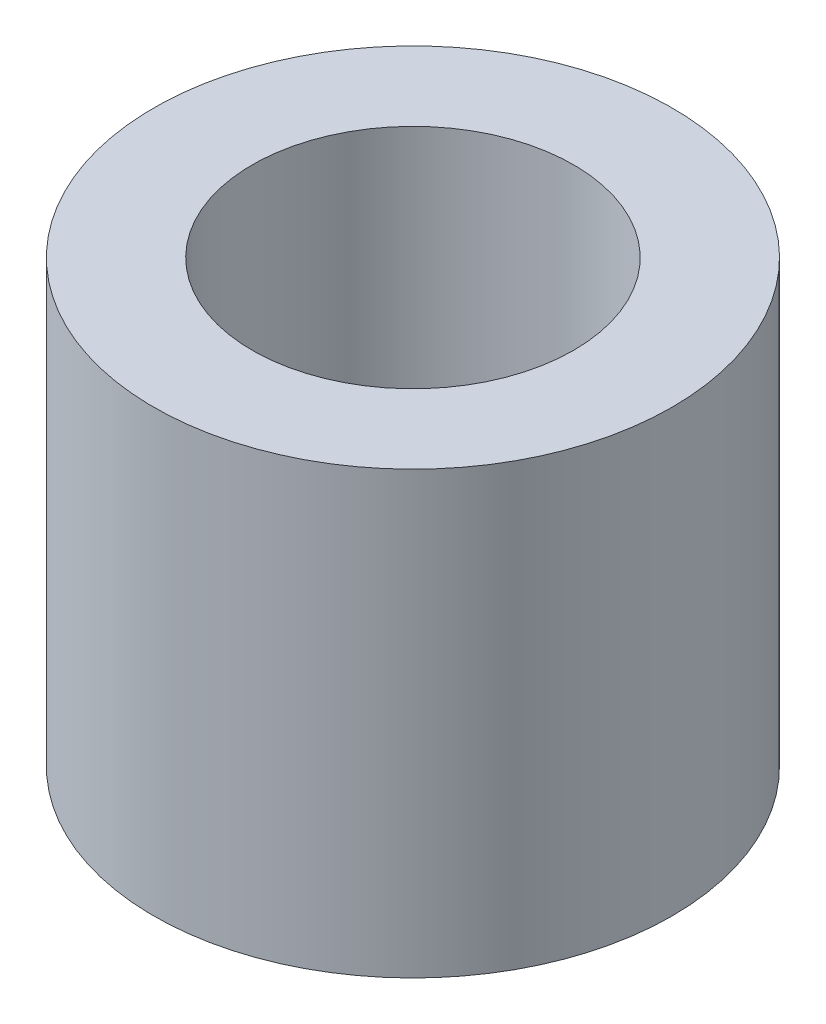
ISO-10303-21;
HEADER;
FILE_DESCRIPTION(('STEP AP214'),'2;1');
FILE_NAME('part.step','',(''),(''),'','','');
FILE_SCHEMA(('AUTOMOTIVE_DESIGN { 1 0 10303 214 1 1 1 1 }'));
ENDSEC;
DATA;
#1=APPLICATION_CONTEXT('core data for automotive mechanical design processes');
#2=APPLICATION_PROTOCOL_DEFINITION('international standard','automotive_design',2000,#1);
#3=PRODUCT_CONTEXT('',#1,'mechanical');
#4=PRODUCT('Part','Part','',(#3));
#5=PRODUCT_RELATED_PRODUCT_CATEGORY('part','',(#4));
#6=PRODUCT_DEFINITION_FORMATION('','',#4);
#7=PRODUCT_DEFINITION_CONTEXT('part definition',#1,'design');
#8=PRODUCT_DEFINITION('design','',#6,#7);
#9=PRODUCT_DEFINITION_SHAPE('','',#8);
#10=(LENGTH_UNIT() NAMED_UNIT(*) SI_UNIT(.MILLI.,.METRE.));
#11=(NAMED_UNIT(*) PLANE_ANGLE_UNIT() SI_UNIT($,.RADIAN.));
#12=(NAMED_UNIT(*) SI_UNIT($,.STERADIAN.) SOLID_ANGLE_UNIT());
#13=UNCERTAINTY_MEASURE_WITH_UNIT(LENGTH_MEASURE(1.E-05),#10,'distance_accuracy_value','');
#14=(GEOMETRIC_REPRESENTATION_CONTEXT(3) GLOBAL_UNCERTAINTY_ASSIGNED_CONTEXT((#13)) GLOBAL_UNIT_ASSIGNED_CONTEXT((#10,
#11,#12)) REPRESENTATION_CONTEXT('',''));
#15=CARTESIAN_POINT('',(0.,0.,0.));
#16=DIRECTION('',(0.,0.,1.));
#17=DIRECTION('',(1.,0.,0.));
#18=AXIS2_PLACEMENT_3D('',#15,#16,#17);
#19=CARTESIAN_POINT('',(0.,8.5,0.));
#20=DIRECTION('',(0.,1.,0.));
#21=DIRECTION('',(1.,0.,0.));
#22=AXIS2_PLACEMENT_3D('',#19,#20,#21);
#23=PLANE('',#22);
#24=CARTESIAN_POINT('',(0.,8.5,0.));
#25=DIRECTION('',(0.,1.,0.));
#26=DIRECTION('',(1.,0.,0.));
#27=AXIS2_PLACEMENT_3D('',#24,#25,#26);
#28=CIRCLE('',#27,10.);
#29=CARTESIAN_POINT('',(10.,8.5,0.));
#30=VERTEX_POINT('',#29);
#31=EDGE_CURVE('E10',#30,#30,#28,.T.);
#32=ORIENTED_EDGE('',*,*,#31,.T.);
#33=EDGE_LOOP('',(#32));
#34=FACE_BOUND('',#33,.T.);
#35=CARTESIAN_POINT('',(0.,8.5,0.));
#36=DIRECTION('',(0.,1.,0.));
#37=DIRECTION('',(1.,0.,0.));
#38=AXIS2_PLACEMENT_3D('',#35,#36,#37);
#39=CIRCLE('',#38,6.2);
#40=CARTESIAN_POINT('',(6.2,8.5,0.));
#41=VERTEX_POINT('',#40);
#42=EDGE_CURVE('E31',#41,#41,#39,.T.);
#43=ORIENTED_EDGE('',*,*,#42,.F.);
#44=EDGE_LOOP('',(#43));
#45=FACE_BOUND('',#44,.T.);
#46=ADVANCED_FACE('F15',(#34,#45),#23,.T.);
#47=CARTESIAN_POINT('',(0.,-8.5,0.));
#48=DIRECTION('',(0.,1.,0.));
#49=DIRECTION('',(1.,0.,0.));
#50=AXIS2_PLACEMENT_3D('',#47,#48,#49);
#51=PLANE('',#50);
#52=CARTESIAN_POINT('',(0.,-8.5,0.));
#53=DIRECTION('',(0.,1.,0.));
#54=DIRECTION('',(1.,0.,0.));
#55=AXIS2_PLACEMENT_3D('',#52,#53,#54);
#56=CIRCLE('',#55,10.);
#57=CARTESIAN_POINT('',(10.,-8.5,0.));
#58=VERTEX_POINT('',#57);
#59=EDGE_CURVE('E22',#58,#58,#56,.T.);
#60=ORIENTED_EDGE('',*,*,#59,.F.);
#61=EDGE_LOOP('',(#60));
#62=FACE_BOUND('',#61,.T.);
#63=CARTESIAN_POINT('',(0.,-8.5,0.));
#64=DIRECTION('',(0.,1.,0.));
#65=DIRECTION('',(1.,0.,0.));
#66=AXIS2_PLACEMENT_3D('',#63,#64,#65);
#67=CIRCLE('',#66,6.2);
#68=CARTESIAN_POINT('',(6.2,-8.5,0.));
#69=VERTEX_POINT('',#68);
#70=EDGE_CURVE('E39',#69,#69,#67,.T.);
#71=ORIENTED_EDGE('',*,*,#70,.T.);
#72=EDGE_LOOP('',(#71));
#73=FACE_BOUND('',#72,.T.);
#74=ADVANCED_FACE('F47',(#62,#73),#51,.F.);
#75=CARTESIAN_POINT('',(0.,-8.5,0.));
#76=DIRECTION('',(0.,1.,0.));
#77=DIRECTION('',(0.,0.,1.));
#78=AXIS2_PLACEMENT_3D('',#75,#76,#77);
#79=CYLINDRICAL_SURFACE('',#78,10.);
#80=ORIENTED_EDGE('',*,*,#31,.F.);
#81=EDGE_LOOP('',(#80));
#82=FACE_BOUND('',#81,.T.);
#83=ORIENTED_EDGE('',*,*,#59,.T.);
#84=EDGE_LOOP('',(#83));
#85=FACE_BOUND('',#84,.T.);
#86=ADVANCED_FACE('F51',(#82,#85),#79,.T.);
#87=CARTESIAN_POINT('',(0.,-8.5,0.));
#88=DIRECTION('',(0.,1.,0.));
#89=DIRECTION('',(0.,0.,1.));
#90=AXIS2_PLACEMENT_3D('',#87,#88,#89);
#91=CYLINDRICAL_SURFACE('',#90,6.2);
#92=ORIENTED_EDGE('',*,*,#42,.T.);
#93=EDGE_LOOP('',(#92));
#94=FACE_BOUND('',#93,.T.);
#95=ORIENTED_EDGE('',*,*,#70,.F.);
#96=EDGE_LOOP('',(#95));
#97=FACE_BOUND('',#96,.T.);
#98=ADVANCED_FACE('F49',(#94,#97),#91,.F.);
#99=CLOSED_SHELL('',(#46,#74,#86,#98));
#100=MANIFOLD_SOLID_BREP('B1',#99);
#101=ADVANCED_BREP_SHAPE_REPRESENTATION('',(#18,#100),#14);
#102=SHAPE_DEFINITION_REPRESENTATION(#9,#101);
ENDSEC;
END-ISO-10303-21;
